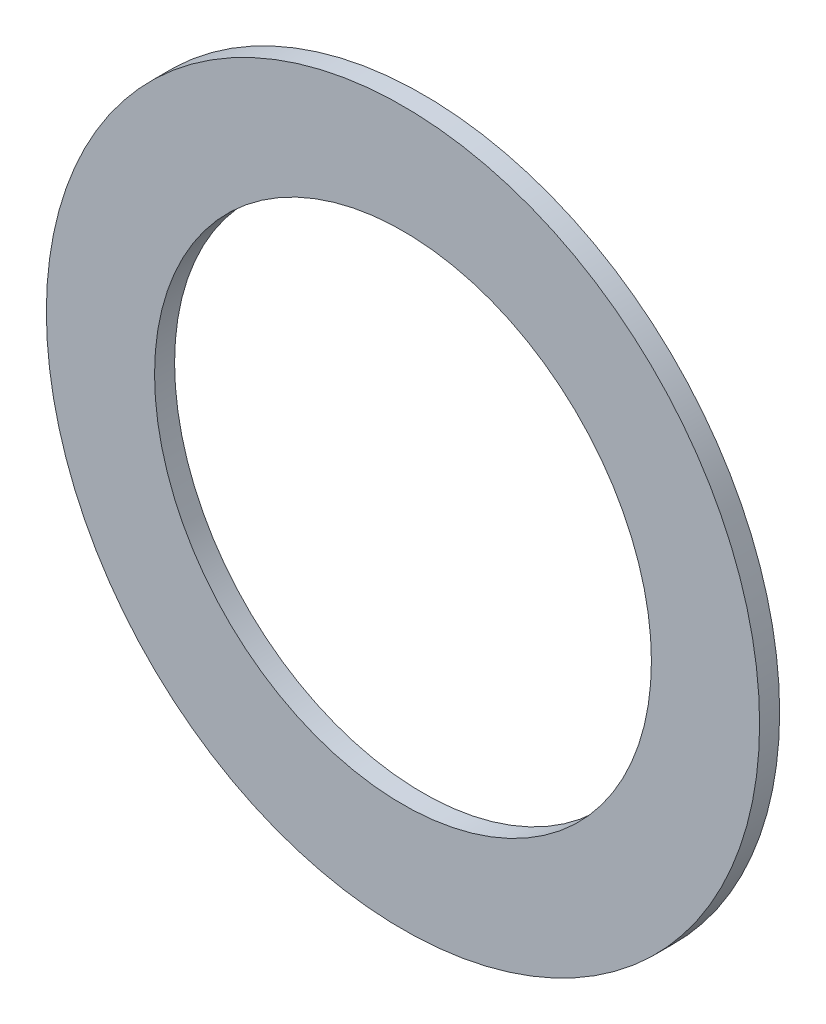
ISO-10303-21;
HEADER;
FILE_DESCRIPTION(('STEP AP214'),'2;1');
FILE_NAME('part.step','',(''),(''),'','','');
FILE_SCHEMA(('AUTOMOTIVE_DESIGN { 1 0 10303 214 1 1 1 1 }'));
ENDSEC;
DATA;
#1=APPLICATION_CONTEXT('core data for automotive mechanical design processes');
#2=APPLICATION_PROTOCOL_DEFINITION('international standard','automotive_design',2000,#1);
#3=PRODUCT_CONTEXT('',#1,'mechanical');
#4=PRODUCT('Part','Part','',(#3));
#5=PRODUCT_RELATED_PRODUCT_CATEGORY('part','',(#4));
#6=PRODUCT_DEFINITION_FORMATION('','',#4);
#7=PRODUCT_DEFINITION_CONTEXT('part definition',#1,'design');
#8=PRODUCT_DEFINITION('design','',#6,#7);
#9=PRODUCT_DEFINITION_SHAPE('','',#8);
#10=(LENGTH_UNIT() NAMED_UNIT(*) SI_UNIT(.MILLI.,.METRE.));
#11=(NAMED_UNIT(*) PLANE_ANGLE_UNIT() SI_UNIT($,.RADIAN.));
#12=(NAMED_UNIT(*) SI_UNIT($,.STERADIAN.) SOLID_ANGLE_UNIT());
#13=UNCERTAINTY_MEASURE_WITH_UNIT(LENGTH_MEASURE(1.E-05),#10,'distance_accuracy_value','');
#14=(GEOMETRIC_REPRESENTATION_CONTEXT(3) GLOBAL_UNCERTAINTY_ASSIGNED_CONTEXT((#13)) GLOBAL_UNIT_ASSIGNED_CONTEXT((#10,
#11,#12)) REPRESENTATION_CONTEXT('',''));
#15=CARTESIAN_POINT('',(0.,0.,0.));
#16=DIRECTION('',(0.,0.,1.));
#17=DIRECTION('',(1.,0.,0.));
#18=AXIS2_PLACEMENT_3D('',#15,#16,#17);
#19=CARTESIAN_POINT('',(0.,0.,0.5));
#20=DIRECTION('',(0.,0.,-1.));
#21=DIRECTION('',(-1.,0.,0.));
#22=AXIS2_PLACEMENT_3D('',#19,#20,#21);
#23=PLANE('',#22);
#24=CARTESIAN_POINT('',(0.,0.,0.5));
#25=DIRECTION('',(0.,0.,1.));
#26=DIRECTION('',(1.,0.,0.));
#27=AXIS2_PLACEMENT_3D('',#24,#25,#26);
#28=CIRCLE('',#27,6.2);
#29=CARTESIAN_POINT('',(6.2,0.,0.5));
#30=VERTEX_POINT('',#29);
#31=EDGE_CURVE('E27',#30,#30,#28,.F.);
#32=ORIENTED_EDGE('',*,*,#31,.T.);
#33=EDGE_LOOP('',(#32));
#34=FACE_BOUND('',#33,.T.);
#35=CARTESIAN_POINT('',(0.,0.,0.5));
#36=DIRECTION('',(0.,0.,1.));
#37=DIRECTION('',(1.,0.,0.));
#38=AXIS2_PLACEMENT_3D('',#35,#36,#37);
#39=CIRCLE('',#38,8.9);
#40=CARTESIAN_POINT('',(8.9,0.,0.5));
#41=VERTEX_POINT('',#40);
#42=EDGE_CURVE('E18',#41,#41,#39,.F.);
#43=ORIENTED_EDGE('',*,*,#42,.F.);
#44=EDGE_LOOP('',(#43));
#45=FACE_BOUND('',#44,.T.);
#46=ADVANCED_FACE('F15',(#34,#45),#23,.F.);
#47=CARTESIAN_POINT('',(0.,0.,0.));
#48=DIRECTION('',(0.,0.,1.));
#49=DIRECTION('',(1.,0.,0.));
#50=AXIS2_PLACEMENT_3D('',#47,#48,#49);
#51=CYLINDRICAL_SURFACE('',#50,8.9);
#52=CARTESIAN_POINT('',(0.,0.,0.));
#53=DIRECTION('',(0.,0.,1.));
#54=DIRECTION('',(1.,0.,0.));
#55=AXIS2_PLACEMENT_3D('',#52,#53,#54);
#56=CIRCLE('',#55,8.9);
#57=CARTESIAN_POINT('',(8.9,0.,0.));
#58=VERTEX_POINT('',#57);
#59=EDGE_CURVE('E22',#58,#58,#56,.F.);
#60=ORIENTED_EDGE('',*,*,#59,.F.);
#61=EDGE_LOOP('',(#60));
#62=FACE_BOUND('',#61,.T.);
#63=ORIENTED_EDGE('',*,*,#42,.T.);
#64=EDGE_LOOP('',(#63));
#65=FACE_BOUND('',#64,.T.);
#66=ADVANCED_FACE('F35',(#62,#65),#51,.T.);
#67=CARTESIAN_POINT('',(0.,0.,0.));
#68=DIRECTION('',(0.,0.,1.));
#69=DIRECTION('',(1.,0.,0.));
#70=AXIS2_PLACEMENT_3D('',#67,#68,#69);
#71=CYLINDRICAL_SURFACE('',#70,6.2);
#72=CARTESIAN_POINT('',(0.,0.,0.));
#73=DIRECTION('',(0.,0.,1.));
#74=DIRECTION('',(1.,0.,0.));
#75=AXIS2_PLACEMENT_3D('',#72,#73,#74);
#76=CIRCLE('',#75,6.2);
#77=CARTESIAN_POINT('',(6.2,0.,0.));
#78=VERTEX_POINT('',#77);
#79=EDGE_CURVE('E10',#78,#78,#76,.T.);
#80=ORIENTED_EDGE('',*,*,#79,.F.);
#81=EDGE_LOOP('',(#80));
#82=FACE_BOUND('',#81,.T.);
#83=ORIENTED_EDGE('',*,*,#31,.F.);
#84=EDGE_LOOP('',(#83));
#85=FACE_BOUND('',#84,.T.);
#86=ADVANCED_FACE('F42',(#82,#85),#71,.F.);
#87=CARTESIAN_POINT('',(0.,0.,0.));
#88=DIRECTION('',(0.,0.,-1.));
#89=DIRECTION('',(-1.,0.,0.));
#90=AXIS2_PLACEMENT_3D('',#87,#88,#89);
#91=PLANE('',#90);
#92=ORIENTED_EDGE('',*,*,#79,.T.);
#93=EDGE_LOOP('',(#92));
#94=FACE_BOUND('',#93,.T.);
#95=ORIENTED_EDGE('',*,*,#59,.T.);
#96=EDGE_LOOP('',(#95));
#97=FACE_BOUND('',#96,.T.);
#98=ADVANCED_FACE('F44',(#94,#97),#91,.T.);
#99=CLOSED_SHELL('',(#46,#66,#86,#98));
#100=MANIFOLD_SOLID_BREP('B1',#99);
#101=ADVANCED_BREP_SHAPE_REPRESENTATION('',(#18,#100),#14);
#102=SHAPE_DEFINITION_REPRESENTATION(#9,#101);
ENDSEC;
END-ISO-10303-21;
